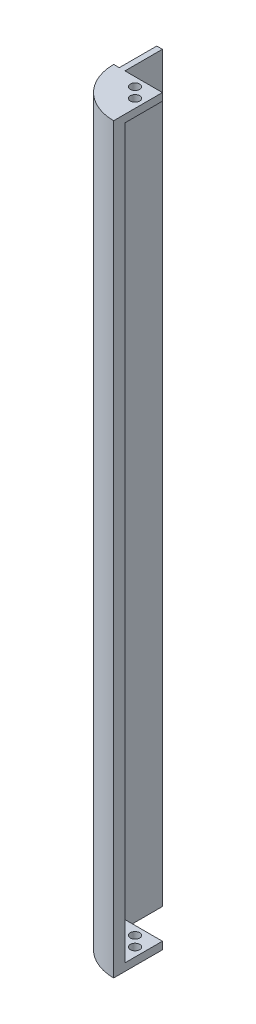
ISO-10303-21;
HEADER;
FILE_DESCRIPTION(('STEP AP214'),'2;1');
FILE_NAME('part.step','',(''),(''),'','','');
FILE_SCHEMA(('AUTOMOTIVE_DESIGN { 1 0 10303 214 1 1 1 1 }'));
ENDSEC;
DATA;
#1=APPLICATION_CONTEXT('core data for automotive mechanical design processes');
#2=APPLICATION_PROTOCOL_DEFINITION('international standard','automotive_design',2000,#1);
#3=PRODUCT_CONTEXT('',#1,'mechanical');
#4=PRODUCT('Part','Part','',(#3));
#5=PRODUCT_RELATED_PRODUCT_CATEGORY('part','',(#4));
#6=PRODUCT_DEFINITION_FORMATION('','',#4);
#7=PRODUCT_DEFINITION_CONTEXT('part definition',#1,'design');
#8=PRODUCT_DEFINITION('design','',#6,#7);
#9=PRODUCT_DEFINITION_SHAPE('','',#8);
#10=(LENGTH_UNIT() NAMED_UNIT(*) SI_UNIT(.MILLI.,.METRE.));
#11=(NAMED_UNIT(*) PLANE_ANGLE_UNIT() SI_UNIT($,.RADIAN.));
#12=(NAMED_UNIT(*) SI_UNIT($,.STERADIAN.) SOLID_ANGLE_UNIT());
#13=UNCERTAINTY_MEASURE_WITH_UNIT(LENGTH_MEASURE(1.E-05),#10,'distance_accuracy_value','');
#14=(GEOMETRIC_REPRESENTATION_CONTEXT(3) GLOBAL_UNCERTAINTY_ASSIGNED_CONTEXT((#13)) GLOBAL_UNIT_ASSIGNED_CONTEXT((#10,
#11,#12)) REPRESENTATION_CONTEXT('',''));
#15=CARTESIAN_POINT('',(0.,0.,0.));
#16=DIRECTION('',(0.,0.,1.));
#17=DIRECTION('',(1.,0.,0.));
#18=AXIS2_PLACEMENT_3D('',#15,#16,#17);
#19=CARTESIAN_POINT('',(-12.5,216.38477631085,-7.5));
#20=DIRECTION('',(0.,-1.,0.));
#21=DIRECTION('',(0.,0.,-1.));
#22=AXIS2_PLACEMENT_3D('',#19,#20,#21);
#23=CYLINDRICAL_SURFACE('',#22,10.);
#24=CARTESIAN_POINT('',(-12.5,2.,-7.5));
#25=DIRECTION('',(0.,1.,0.));
#26=DIRECTION('',(0.,0.,1.));
#27=AXIS2_PLACEMENT_3D('',#24,#25,#26);
#28=CIRCLE('',#27,10.);
#29=CARTESIAN_POINT('',(-22.5,2.,-7.5));
#30=VERTEX_POINT('',#29);
#31=CARTESIAN_POINT('',(-12.5,2.,2.5));
#32=VERTEX_POINT('',#31);
#33=EDGE_CURVE('E94',#30,#32,#28,.T.);
#34=ORIENTED_EDGE('',*,*,#33,.F.);
#35=DIRECTION('',(0.,-1.,0.));
#36=VECTOR('',#35,1.);
#37=CARTESIAN_POINT('',(-22.5,216.38477631085,-7.5));
#38=LINE('',#37,#36);
#39=CARTESIAN_POINT('',(-22.5,196.,-7.5));
#40=VERTEX_POINT('',#39);
#41=EDGE_CURVE('E242',#40,#30,#38,.T.);
#42=ORIENTED_EDGE('',*,*,#41,.F.);
#43=CARTESIAN_POINT('',(-12.5,196.,-7.5));
#44=DIRECTION('',(0.,1.,0.));
#45=DIRECTION('',(0.,0.,1.));
#46=AXIS2_PLACEMENT_3D('',#43,#44,#45);
#47=CIRCLE('',#46,10.);
#48=CARTESIAN_POINT('',(-12.5,196.,2.5));
#49=VERTEX_POINT('',#48);
#50=EDGE_CURVE('E191',#40,#49,#47,.T.);
#51=ORIENTED_EDGE('',*,*,#50,.T.);
#52=DIRECTION('',(0.,1.,0.));
#53=VECTOR('',#52,1.);
#54=CARTESIAN_POINT('',(-12.5,2.,2.5));
#55=LINE('',#54,#53);
#56=EDGE_CURVE('E12',#32,#49,#55,.T.);
#57=ORIENTED_EDGE('',*,*,#56,.F.);
#58=EDGE_LOOP('',(#34,#42,#51,#57));
#59=FACE_BOUND('',#58,.T.);
#60=ADVANCED_FACE('F80',(#59),#23,.F.);
#61=CARTESIAN_POINT('',(0.,0.,0.));
#62=DIRECTION('',(0.,1.,0.));
#63=DIRECTION('',(0.,0.,1.));
#64=AXIS2_PLACEMENT_3D('',#61,#62,#63);
#65=PLANE('',#64);
#66=CARTESIAN_POINT('',(-14.8,0.,-2.5));
#67=DIRECTION('',(0.,1.,0.));
#68=DIRECTION('',(0.,0.,1.));
#69=AXIS2_PLACEMENT_3D('',#66,#67,#68);
#70=CIRCLE('',#69,1.25);
#71=CARTESIAN_POINT('',(-14.8,0.,-1.25));
#72=VERTEX_POINT('',#71);
#73=EDGE_CURVE('E180',#72,#72,#70,.F.);
#74=ORIENTED_EDGE('',*,*,#73,.F.);
#75=EDGE_LOOP('',(#74));
#76=FACE_BOUND('',#75,.T.);
#77=CARTESIAN_POINT('',(-17.5,0.,-5.2));
#78=DIRECTION('',(0.,1.,0.));
#79=DIRECTION('',(0.,0.,1.));
#80=AXIS2_PLACEMENT_3D('',#77,#78,#79);
#81=CIRCLE('',#80,1.25);
#82=CARTESIAN_POINT('',(-17.5,0.,-3.95));
#83=VERTEX_POINT('',#82);
#84=EDGE_CURVE('E339',#83,#83,#81,.F.);
#85=ORIENTED_EDGE('',*,*,#84,.F.);
#86=EDGE_LOOP('',(#85));
#87=FACE_BOUND('',#86,.T.);
#88=DIRECTION('',(0.,0.,-1.));
#89=VECTOR('',#88,1.);
#90=CARTESIAN_POINT('',(-12.5,0.,0.));
#91=LINE('',#90,#89);
#92=CARTESIAN_POINT('',(-12.5,0.,5.5));
#93=VERTEX_POINT('',#92);
#94=CARTESIAN_POINT('',(-12.5,0.,-7.5));
#95=VERTEX_POINT('',#94);
#96=EDGE_CURVE('E164',#93,#95,#91,.T.);
#97=ORIENTED_EDGE('',*,*,#96,.F.);
#98=CARTESIAN_POINT('',(-12.5,0.,-7.5));
#99=DIRECTION('',(0.,1.,0.));
#100=DIRECTION('',(0.,0.,1.));
#101=AXIS2_PLACEMENT_3D('',#98,#99,#100);
#102=CIRCLE('',#101,13.);
#103=CARTESIAN_POINT('',(-25.5,0.,-7.5));
#104=VERTEX_POINT('',#103);
#105=EDGE_CURVE('E229',#93,#104,#102,.F.);
#106=ORIENTED_EDGE('',*,*,#105,.T.);
#107=DIRECTION('',(1.,0.,0.));
#108=VECTOR('',#107,1.);
#109=CARTESIAN_POINT('',(-22.5,0.,-7.5));
#110=LINE('',#109,#108);
#111=CARTESIAN_POINT('',(-24.,0.,-7.5));
#112=VERTEX_POINT('',#111);
#113=EDGE_CURVE('E231',#104,#112,#110,.T.);
#114=ORIENTED_EDGE('',*,*,#113,.T.);
#115=DIRECTION('',(0.,0.,1.));
#116=VECTOR('',#115,1.);
#117=CARTESIAN_POINT('',(-24.,0.,-17.5));
#118=LINE('',#117,#116);
#119=CARTESIAN_POINT('',(-24.,0.,-17.5));
#120=VERTEX_POINT('',#119);
#121=EDGE_CURVE('E221',#120,#112,#118,.T.);
#122=ORIENTED_EDGE('',*,*,#121,.F.);
#123=DIRECTION('',(-1.,0.,0.));
#124=VECTOR('',#123,1.);
#125=CARTESIAN_POINT('',(-22.5,0.,-17.5));
#126=LINE('',#125,#124);
#127=CARTESIAN_POINT('',(-22.5,0.,-17.5));
#128=VERTEX_POINT('',#127);
#129=EDGE_CURVE('E208',#128,#120,#126,.T.);
#130=ORIENTED_EDGE('',*,*,#129,.F.);
#131=DIRECTION('',(0.,0.,1.));
#132=VECTOR('',#131,1.);
#133=CARTESIAN_POINT('',(-22.5,0.,-17.5));
#134=LINE('',#133,#132);
#135=CARTESIAN_POINT('',(-22.5,0.,-7.5));
#136=VERTEX_POINT('',#135);
#137=EDGE_CURVE('E227',#128,#136,#134,.T.);
#138=ORIENTED_EDGE('',*,*,#137,.T.);
#139=DIRECTION('',(-1.,0.,0.));
#140=VECTOR('',#139,1.);
#141=CARTESIAN_POINT('',(-12.5,0.,-7.5));
#142=LINE('',#141,#140);
#143=EDGE_CURVE('E173',#95,#136,#142,.T.);
#144=ORIENTED_EDGE('',*,*,#143,.F.);
#145=EDGE_LOOP('',(#97,#106,#114,#122,#130,#138,#144));
#146=FACE_BOUND('',#145,.T.);
#147=ADVANCED_FACE('F79',(#76,#87,#146),#65,.F.);
#148=CARTESIAN_POINT('',(0.,198.,0.));
#149=DIRECTION('',(0.,-1.,0.));
#150=DIRECTION('',(0.,0.,-1.));
#151=AXIS2_PLACEMENT_3D('',#148,#149,#150);
#152=PLANE('',#151);
#153=CARTESIAN_POINT('',(-14.8,198.,-2.5));
#154=DIRECTION('',(0.,-1.,0.));
#155=DIRECTION('',(0.,0.,-1.));
#156=AXIS2_PLACEMENT_3D('',#153,#154,#155);
#157=CIRCLE('',#156,1.25);
#158=CARTESIAN_POINT('',(-14.8,198.,-3.75));
#159=VERTEX_POINT('',#158);
#160=EDGE_CURVE('E189',#159,#159,#157,.T.);
#161=ORIENTED_EDGE('',*,*,#160,.T.);
#162=EDGE_LOOP('',(#161));
#163=FACE_BOUND('',#162,.T.);
#164=CARTESIAN_POINT('',(-17.5,198.,-5.2));
#165=DIRECTION('',(0.,-1.,0.));
#166=DIRECTION('',(0.,0.,-1.));
#167=AXIS2_PLACEMENT_3D('',#164,#165,#166);
#168=CIRCLE('',#167,1.25);
#169=CARTESIAN_POINT('',(-17.5,198.,-6.45));
#170=VERTEX_POINT('',#169);
#171=EDGE_CURVE('E182',#170,#170,#168,.T.);
#172=ORIENTED_EDGE('',*,*,#171,.T.);
#173=EDGE_LOOP('',(#172));
#174=FACE_BOUND('',#173,.T.);
#175=CARTESIAN_POINT('',(-12.5,198.,-7.5));
#176=DIRECTION('',(0.,-1.,0.));
#177=DIRECTION('',(0.,0.,-1.));
#178=AXIS2_PLACEMENT_3D('',#175,#176,#177);
#179=CIRCLE('',#178,13.);
#180=CARTESIAN_POINT('',(-12.5,198.,5.5));
#181=VERTEX_POINT('',#180);
#182=CARTESIAN_POINT('',(-25.5,198.,-7.5));
#183=VERTEX_POINT('',#182);
#184=EDGE_CURVE('E240',#181,#183,#179,.T.);
#185=ORIENTED_EDGE('',*,*,#184,.F.);
#186=DIRECTION('',(0.,0.,1.));
#187=VECTOR('',#186,1.);
#188=CARTESIAN_POINT('',(-12.5,198.,2.5));
#189=LINE('',#188,#187);
#190=CARTESIAN_POINT('',(-12.5,198.,-7.5));
#191=VERTEX_POINT('',#190);
#192=EDGE_CURVE('E241',#191,#181,#189,.T.);
#193=ORIENTED_EDGE('',*,*,#192,.F.);
#194=DIRECTION('',(-1.,0.,0.));
#195=VECTOR('',#194,1.);
#196=CARTESIAN_POINT('',(-12.5,198.,-7.5));
#197=LINE('',#196,#195);
#198=CARTESIAN_POINT('',(-22.5,198.,-7.5));
#199=VERTEX_POINT('',#198);
#200=EDGE_CURVE('E194',#191,#199,#197,.T.);
#201=ORIENTED_EDGE('',*,*,#200,.T.);
#202=DIRECTION('',(0.,0.,1.));
#203=VECTOR('',#202,1.);
#204=CARTESIAN_POINT('',(-22.5,198.,-17.5));
#205=LINE('',#204,#203);
#206=CARTESIAN_POINT('',(-22.5,198.,-17.5));
#207=VERTEX_POINT('',#206);
#208=EDGE_CURVE('E217',#207,#199,#205,.T.);
#209=ORIENTED_EDGE('',*,*,#208,.F.);
#210=DIRECTION('',(1.,0.,0.));
#211=VECTOR('',#210,1.);
#212=CARTESIAN_POINT('',(-22.5,198.,-17.5));
#213=LINE('',#212,#211);
#214=CARTESIAN_POINT('',(-24.,198.,-17.5));
#215=VERTEX_POINT('',#214);
#216=EDGE_CURVE('E213',#215,#207,#213,.T.);
#217=ORIENTED_EDGE('',*,*,#216,.F.);
#218=DIRECTION('',(0.,0.,1.));
#219=VECTOR('',#218,1.);
#220=CARTESIAN_POINT('',(-24.,198.,-17.5));
#221=LINE('',#220,#219);
#222=CARTESIAN_POINT('',(-24.,198.,-7.5));
#223=VERTEX_POINT('',#222);
#224=EDGE_CURVE('E222',#215,#223,#221,.T.);
#225=ORIENTED_EDGE('',*,*,#224,.T.);
#226=DIRECTION('',(1.,0.,0.));
#227=VECTOR('',#226,1.);
#228=CARTESIAN_POINT('',(-22.5,198.,-7.5));
#229=LINE('',#228,#227);
#230=EDGE_CURVE('E239',#183,#223,#229,.T.);
#231=ORIENTED_EDGE('',*,*,#230,.F.);
#232=EDGE_LOOP('',(#185,#193,#201,#209,#217,#225,#231));
#233=FACE_BOUND('',#232,.T.);
#234=ADVANCED_FACE('F270',(#163,#174,#233),#152,.F.);
#235=CARTESIAN_POINT('',(-22.5,216.38477631085,-7.5));
#236=DIRECTION('',(0.,0.,1.));
#237=DIRECTION('',(1.,0.,0.));
#238=AXIS2_PLACEMENT_3D('',#235,#236,#237);
#239=PLANE('',#238);
#240=DIRECTION('',(0.,1.,0.));
#241=VECTOR('',#240,1.);
#242=CARTESIAN_POINT('',(-24.,198.,-7.5));
#243=LINE('',#242,#241);
#244=EDGE_CURVE('E207',#112,#223,#243,.T.);
#245=ORIENTED_EDGE('',*,*,#244,.F.);
#246=ORIENTED_EDGE('',*,*,#113,.F.);
#247=DIRECTION('',(0.,-1.,0.));
#248=VECTOR('',#247,1.);
#249=CARTESIAN_POINT('',(-25.5,216.38477631085,-7.5));
#250=LINE('',#249,#248);
#251=EDGE_CURVE('E236',#183,#104,#250,.T.);
#252=ORIENTED_EDGE('',*,*,#251,.F.);
#253=ORIENTED_EDGE('',*,*,#230,.T.);
#254=EDGE_LOOP('',(#245,#246,#252,#253));
#255=FACE_BOUND('',#254,.T.);
#256=ADVANCED_FACE('F271',(#255),#239,.F.);
#257=CARTESIAN_POINT('',(-12.5,216.38477631085,2.5));
#258=DIRECTION('',(-1.,0.,0.));
#259=DIRECTION('',(0.,0.,1.));
#260=AXIS2_PLACEMENT_3D('',#257,#258,#259);
#261=PLANE('',#260);
#262=ORIENTED_EDGE('',*,*,#192,.T.);
#263=DIRECTION('',(0.,1.,0.));
#264=VECTOR('',#263,1.);
#265=CARTESIAN_POINT('',(-12.5,0.,5.5));
#266=LINE('',#265,#264);
#267=EDGE_CURVE('E82',#93,#181,#266,.T.);
#268=ORIENTED_EDGE('',*,*,#267,.F.);
#269=ORIENTED_EDGE('',*,*,#96,.T.);
#270=DIRECTION('',(0.,-1.,0.));
#271=VECTOR('',#270,1.);
#272=CARTESIAN_POINT('',(-12.5,2.,-7.5));
#273=LINE('',#272,#271);
#274=CARTESIAN_POINT('',(-12.5,2.,-7.5));
#275=VERTEX_POINT('',#274);
#276=EDGE_CURVE('E162',#275,#95,#273,.T.);
#277=ORIENTED_EDGE('',*,*,#276,.F.);
#278=DIRECTION('',(0.,0.,-1.));
#279=VECTOR('',#278,1.);
#280=CARTESIAN_POINT('',(-12.5,2.,2.5));
#281=LINE('',#280,#279);
#282=EDGE_CURVE('E155',#32,#275,#281,.T.);
#283=ORIENTED_EDGE('',*,*,#282,.F.);
#284=ORIENTED_EDGE('',*,*,#56,.T.);
#285=DIRECTION('',(0.,0.,-1.));
#286=VECTOR('',#285,1.);
#287=CARTESIAN_POINT('',(-12.5,196.,2.5));
#288=LINE('',#287,#286);
#289=CARTESIAN_POINT('',(-12.5,196.,-7.5));
#290=VERTEX_POINT('',#289);
#291=EDGE_CURVE('E192',#49,#290,#288,.T.);
#292=ORIENTED_EDGE('',*,*,#291,.T.);
#293=DIRECTION('',(0.,1.,0.));
#294=VECTOR('',#293,1.);
#295=CARTESIAN_POINT('',(-12.5,196.,-7.5));
#296=LINE('',#295,#294);
#297=EDGE_CURVE('E198',#290,#191,#296,.T.);
#298=ORIENTED_EDGE('',*,*,#297,.T.);
#299=EDGE_LOOP('',(#262,#268,#269,#277,#283,#284,#292,#298));
#300=FACE_BOUND('',#299,.T.);
#301=ADVANCED_FACE('F161',(#300),#261,.F.);
#302=CARTESIAN_POINT('',(-12.5,216.38477631085,-7.5));
#303=DIRECTION('',(0.,-1.,0.));
#304=DIRECTION('',(0.,0.,-1.));
#305=AXIS2_PLACEMENT_3D('',#302,#303,#304);
#306=CYLINDRICAL_SURFACE('',#305,13.);
#307=ORIENTED_EDGE('',*,*,#267,.T.);
#308=ORIENTED_EDGE('',*,*,#184,.T.);
#309=ORIENTED_EDGE('',*,*,#251,.T.);
#310=ORIENTED_EDGE('',*,*,#105,.F.);
#311=EDGE_LOOP('',(#307,#308,#309,#310));
#312=FACE_BOUND('',#311,.T.);
#313=ADVANCED_FACE('F252',(#312),#306,.T.);
#314=CARTESIAN_POINT('',(-22.5,198.,-17.5));
#315=DIRECTION('',(-1.,0.,0.));
#316=DIRECTION('',(0.,0.,1.));
#317=AXIS2_PLACEMENT_3D('',#314,#315,#316);
#318=PLANE('',#317);
#319=EDGE_CURVE('E244',#199,#40,#38,.T.);
#320=ORIENTED_EDGE('',*,*,#319,.T.);
#321=ORIENTED_EDGE('',*,*,#41,.T.);
#322=DIRECTION('',(0.,-1.,0.));
#323=VECTOR('',#322,1.);
#324=CARTESIAN_POINT('',(-22.5,2.,-7.5));
#325=LINE('',#324,#323);
#326=EDGE_CURVE('E156',#30,#136,#325,.T.);
#327=ORIENTED_EDGE('',*,*,#326,.T.);
#328=ORIENTED_EDGE('',*,*,#137,.F.);
#329=DIRECTION('',(0.,-1.,0.));
#330=VECTOR('',#329,1.);
#331=CARTESIAN_POINT('',(-22.5,198.,-17.5));
#332=LINE('',#331,#330);
#333=EDGE_CURVE('E210',#207,#128,#332,.T.);
#334=ORIENTED_EDGE('',*,*,#333,.F.);
#335=ORIENTED_EDGE('',*,*,#208,.T.);
#336=EDGE_LOOP('',(#320,#321,#327,#328,#334,#335));
#337=FACE_BOUND('',#336,.T.);
#338=ADVANCED_FACE('F258',(#337),#318,.F.);
#339=CARTESIAN_POINT('',(-24.,198.,-17.5));
#340=DIRECTION('',(1.,0.,0.));
#341=DIRECTION('',(0.,1.,0.));
#342=AXIS2_PLACEMENT_3D('',#339,#340,#341);
#343=PLANE('',#342);
#344=ORIENTED_EDGE('',*,*,#244,.T.);
#345=ORIENTED_EDGE('',*,*,#224,.F.);
#346=DIRECTION('',(0.,1.,0.));
#347=VECTOR('',#346,1.);
#348=CARTESIAN_POINT('',(-24.,198.,-17.5));
#349=LINE('',#348,#347);
#350=EDGE_CURVE('E211',#120,#215,#349,.T.);
#351=ORIENTED_EDGE('',*,*,#350,.F.);
#352=ORIENTED_EDGE('',*,*,#121,.T.);
#353=EDGE_LOOP('',(#344,#345,#351,#352));
#354=FACE_BOUND('',#353,.T.);
#355=ADVANCED_FACE('F279',(#354),#343,.F.);
#356=CARTESIAN_POINT('',(0.,0.,-17.5));
#357=DIRECTION('',(0.,0.,-1.));
#358=DIRECTION('',(-1.,0.,0.));
#359=AXIS2_PLACEMENT_3D('',#356,#357,#358);
#360=PLANE('',#359);
#361=ORIENTED_EDGE('',*,*,#333,.T.);
#362=ORIENTED_EDGE('',*,*,#129,.T.);
#363=ORIENTED_EDGE('',*,*,#350,.T.);
#364=ORIENTED_EDGE('',*,*,#216,.T.);
#365=EDGE_LOOP('',(#361,#362,#363,#364));
#366=FACE_BOUND('',#365,.T.);
#367=ADVANCED_FACE('F280',(#366),#360,.T.);
#368=CARTESIAN_POINT('',(-12.5,196.,-7.5));
#369=DIRECTION('',(0.,0.,-1.));
#370=DIRECTION('',(-1.,0.,0.));
#371=AXIS2_PLACEMENT_3D('',#368,#369,#370);
#372=PLANE('',#371);
#373=ORIENTED_EDGE('',*,*,#200,.F.);
#374=ORIENTED_EDGE('',*,*,#297,.F.);
#375=DIRECTION('',(-1.,0.,0.));
#376=VECTOR('',#375,1.);
#377=CARTESIAN_POINT('',(-12.5,196.,-7.5));
#378=LINE('',#377,#376);
#379=EDGE_CURVE('E199',#290,#40,#378,.T.);
#380=ORIENTED_EDGE('',*,*,#379,.T.);
#381=ORIENTED_EDGE('',*,*,#319,.F.);
#382=EDGE_LOOP('',(#373,#374,#380,#381));
#383=FACE_BOUND('',#382,.T.);
#384=ADVANCED_FACE('F263',(#383),#372,.T.);
#385=CARTESIAN_POINT('',(-12.5,196.,-7.5));
#386=DIRECTION('',(0.,1.,0.));
#387=DIRECTION('',(0.,0.,1.));
#388=AXIS2_PLACEMENT_3D('',#385,#386,#387);
#389=PLANE('',#388);
#390=CARTESIAN_POINT('',(-14.8,196.,-2.5));
#391=DIRECTION('',(0.,-1.,0.));
#392=DIRECTION('',(0.,0.,-1.));
#393=AXIS2_PLACEMENT_3D('',#390,#391,#392);
#394=CIRCLE('',#393,1.25);
#395=CARTESIAN_POINT('',(-14.8,196.,-3.75));
#396=VERTEX_POINT('',#395);
#397=EDGE_CURVE('E179',#396,#396,#394,.T.);
#398=ORIENTED_EDGE('',*,*,#397,.F.);
#399=EDGE_LOOP('',(#398));
#400=FACE_BOUND('',#399,.T.);
#401=CARTESIAN_POINT('',(-17.5,196.,-5.2));
#402=DIRECTION('',(0.,-1.,0.));
#403=DIRECTION('',(0.,0.,-1.));
#404=AXIS2_PLACEMENT_3D('',#401,#402,#403);
#405=CIRCLE('',#404,1.25);
#406=CARTESIAN_POINT('',(-17.5,196.,-6.45));
#407=VERTEX_POINT('',#406);
#408=EDGE_CURVE('E169',#407,#407,#405,.T.);
#409=ORIENTED_EDGE('',*,*,#408,.F.);
#410=EDGE_LOOP('',(#409));
#411=FACE_BOUND('',#410,.T.);
#412=ORIENTED_EDGE('',*,*,#50,.F.);
#413=ORIENTED_EDGE('',*,*,#379,.F.);
#414=ORIENTED_EDGE('',*,*,#291,.F.);
#415=EDGE_LOOP('',(#412,#413,#414));
#416=FACE_BOUND('',#415,.T.);
#417=ADVANCED_FACE('F264',(#400,#411,#416),#389,.F.);
#418=CARTESIAN_POINT('',(-17.5,199.,-5.2));
#419=DIRECTION('',(0.,-1.,0.));
#420=DIRECTION('',(0.,0.,-1.));
#421=AXIS2_PLACEMENT_3D('',#418,#419,#420);
#422=CYLINDRICAL_SURFACE('',#421,1.25);
#423=ORIENTED_EDGE('',*,*,#408,.T.);
#424=EDGE_LOOP('',(#423));
#425=FACE_BOUND('',#424,.T.);
#426=ORIENTED_EDGE('',*,*,#171,.F.);
#427=EDGE_LOOP('',(#426));
#428=FACE_BOUND('',#427,.T.);
#429=ADVANCED_FACE('F310',(#425,#428),#422,.F.);
#430=CARTESIAN_POINT('',(-14.8,199.,-2.5));
#431=DIRECTION('',(0.,-1.,0.));
#432=DIRECTION('',(0.,0.,-1.));
#433=AXIS2_PLACEMENT_3D('',#430,#431,#432);
#434=CYLINDRICAL_SURFACE('',#433,1.25);
#435=ORIENTED_EDGE('',*,*,#397,.T.);
#436=EDGE_LOOP('',(#435));
#437=FACE_BOUND('',#436,.T.);
#438=ORIENTED_EDGE('',*,*,#160,.F.);
#439=EDGE_LOOP('',(#438));
#440=FACE_BOUND('',#439,.T.);
#441=ADVANCED_FACE('F307',(#437,#440),#434,.F.);
#442=CARTESIAN_POINT('',(-12.5,2.,-7.5));
#443=DIRECTION('',(0.,0.,1.));
#444=DIRECTION('',(1.,0.,0.));
#445=AXIS2_PLACEMENT_3D('',#442,#443,#444);
#446=PLANE('',#445);
#447=ORIENTED_EDGE('',*,*,#143,.T.);
#448=ORIENTED_EDGE('',*,*,#326,.F.);
#449=DIRECTION('',(-1.,0.,0.));
#450=VECTOR('',#449,1.);
#451=CARTESIAN_POINT('',(-12.5,2.,-7.5));
#452=LINE('',#451,#450);
#453=EDGE_CURVE('E159',#275,#30,#452,.T.);
#454=ORIENTED_EDGE('',*,*,#453,.F.);
#455=ORIENTED_EDGE('',*,*,#276,.T.);
#456=EDGE_LOOP('',(#447,#448,#454,#455));
#457=FACE_BOUND('',#456,.T.);
#458=ADVANCED_FACE('F171',(#457),#446,.F.);
#459=CARTESIAN_POINT('',(-12.5,2.,-7.5));
#460=DIRECTION('',(0.,-1.,0.));
#461=DIRECTION('',(0.,0.,1.));
#462=AXIS2_PLACEMENT_3D('',#459,#460,#461);
#463=PLANE('',#462);
#464=CARTESIAN_POINT('',(-14.8,2.,-2.5));
#465=DIRECTION('',(0.,-1.,0.));
#466=DIRECTION('',(0.,0.,-1.));
#467=AXIS2_PLACEMENT_3D('',#464,#465,#466);
#468=CIRCLE('',#467,1.25);
#469=CARTESIAN_POINT('',(-14.8,2.,-3.75));
#470=VERTEX_POINT('',#469);
#471=EDGE_CURVE('E337',#470,#470,#468,.T.);
#472=ORIENTED_EDGE('',*,*,#471,.T.);
#473=EDGE_LOOP('',(#472));
#474=FACE_BOUND('',#473,.T.);
#475=CARTESIAN_POINT('',(-17.5,2.,-5.2));
#476=DIRECTION('',(0.,-1.,0.));
#477=DIRECTION('',(0.,0.,-1.));
#478=AXIS2_PLACEMENT_3D('',#475,#476,#477);
#479=CIRCLE('',#478,1.25);
#480=CARTESIAN_POINT('',(-17.5,2.,-6.45));
#481=VERTEX_POINT('',#480);
#482=EDGE_CURVE('E345',#481,#481,#479,.T.);
#483=ORIENTED_EDGE('',*,*,#482,.T.);
#484=EDGE_LOOP('',(#483));
#485=FACE_BOUND('',#484,.T.);
#486=ORIENTED_EDGE('',*,*,#33,.T.);
#487=ORIENTED_EDGE('',*,*,#282,.T.);
#488=ORIENTED_EDGE('',*,*,#453,.T.);
#489=EDGE_LOOP('',(#486,#487,#488));
#490=FACE_BOUND('',#489,.T.);
#491=ADVANCED_FACE('F153',(#474,#485,#490),#463,.F.);
#492=CARTESIAN_POINT('',(-17.5,-0.999999999999998,-5.2));
#493=DIRECTION('',(0.,1.,0.));
#494=DIRECTION('',(0.,0.,1.));
#495=AXIS2_PLACEMENT_3D('',#492,#493,#494);
#496=CYLINDRICAL_SURFACE('',#495,1.25);
#497=ORIENTED_EDGE('',*,*,#482,.F.);
#498=EDGE_LOOP('',(#497));
#499=FACE_BOUND('',#498,.T.);
#500=ORIENTED_EDGE('',*,*,#84,.T.);
#501=EDGE_LOOP('',(#500));
#502=FACE_BOUND('',#501,.T.);
#503=ADVANCED_FACE('F325',(#499,#502),#496,.F.);
#504=CARTESIAN_POINT('',(-14.8,-0.999999999999998,-2.5));
#505=DIRECTION('',(0.,1.,0.));
#506=DIRECTION('',(0.,0.,1.));
#507=AXIS2_PLACEMENT_3D('',#504,#505,#506);
#508=CYLINDRICAL_SURFACE('',#507,1.25);
#509=ORIENTED_EDGE('',*,*,#471,.F.);
#510=EDGE_LOOP('',(#509));
#511=FACE_BOUND('',#510,.T.);
#512=ORIENTED_EDGE('',*,*,#73,.T.);
#513=EDGE_LOOP('',(#512));
#514=FACE_BOUND('',#513,.T.);
#515=ADVANCED_FACE('F329',(#511,#514),#508,.F.);
#516=CLOSED_SHELL('',(#60,#147,#234,#256,#301,#313,#338,#355,#367,#384,#417,#429,#441,#458,#491,
#503,#515));
#517=MANIFOLD_SOLID_BREP('B2',#516);
#518=ADVANCED_BREP_SHAPE_REPRESENTATION('',(#18,#517),#14);
#519=SHAPE_DEFINITION_REPRESENTATION(#9,#518);
ENDSEC;
END-ISO-10303-21;
